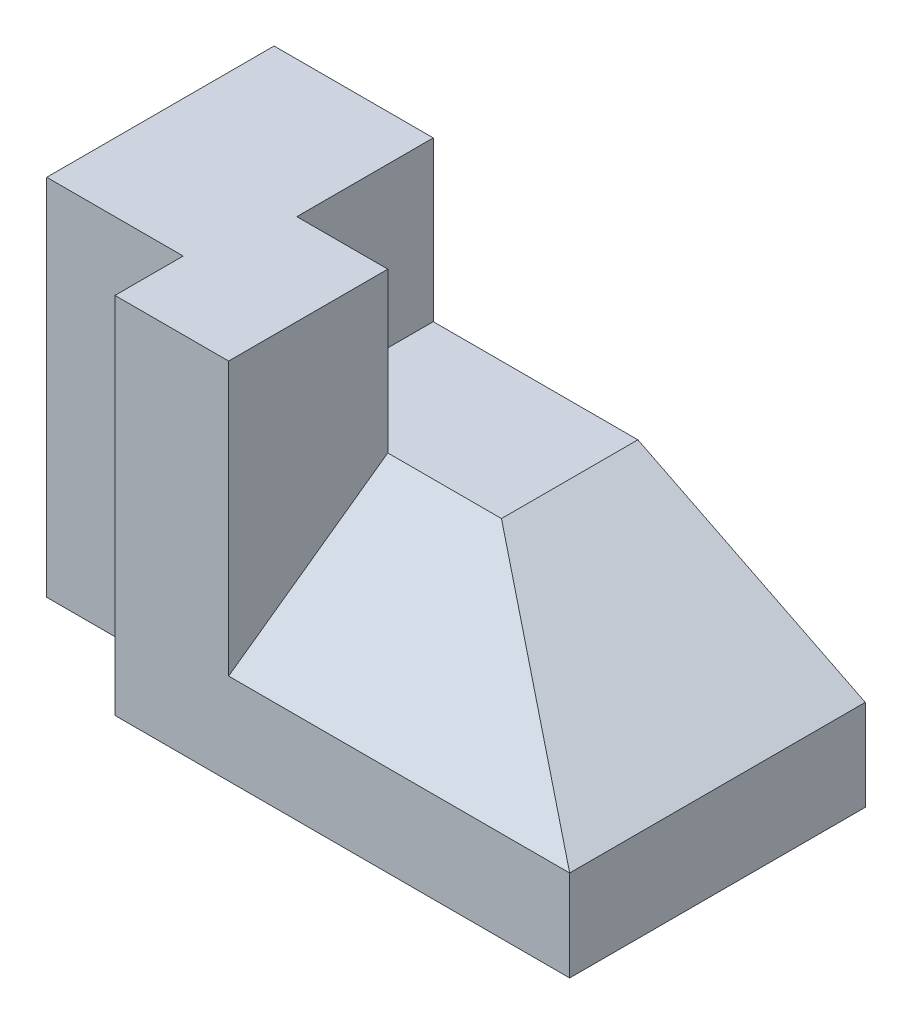
ISO-10303-21;
HEADER;
FILE_DESCRIPTION(('STEP AP214'),'2;1');
FILE_NAME('part.step','',(''),(''),'','','');
FILE_SCHEMA(('AUTOMOTIVE_DESIGN { 1 0 10303 214 1 1 1 1 }'));
ENDSEC;
DATA;
#1=APPLICATION_CONTEXT('core data for automotive mechanical design processes');
#2=APPLICATION_PROTOCOL_DEFINITION('international standard','automotive_design',2000,#1);
#3=PRODUCT_CONTEXT('',#1,'mechanical');
#4=PRODUCT('Part','Part','',(#3));
#5=PRODUCT_RELATED_PRODUCT_CATEGORY('part','',(#4));
#6=PRODUCT_DEFINITION_FORMATION('','',#4);
#7=PRODUCT_DEFINITION_CONTEXT('part definition',#1,'design');
#8=PRODUCT_DEFINITION('design','',#6,#7);
#9=PRODUCT_DEFINITION_SHAPE('','',#8);
#10=(LENGTH_UNIT() NAMED_UNIT(*) SI_UNIT(.MILLI.,.METRE.));
#11=(NAMED_UNIT(*) PLANE_ANGLE_UNIT() SI_UNIT($,.RADIAN.));
#12=(NAMED_UNIT(*) SI_UNIT($,.STERADIAN.) SOLID_ANGLE_UNIT());
#13=UNCERTAINTY_MEASURE_WITH_UNIT(LENGTH_MEASURE(1.E-05),#10,'distance_accuracy_value','');
#14=(GEOMETRIC_REPRESENTATION_CONTEXT(3) GLOBAL_UNCERTAINTY_ASSIGNED_CONTEXT((#13)) GLOBAL_UNIT_ASSIGNED_CONTEXT((#10,
#11,#12)) REPRESENTATION_CONTEXT('',''));
#15=CARTESIAN_POINT('',(0.,0.,0.));
#16=DIRECTION('',(0.,0.,1.));
#17=DIRECTION('',(1.,0.,0.));
#18=AXIS2_PLACEMENT_3D('',#15,#16,#17);
#19=CARTESIAN_POINT('',(4.99999999999999,45.,0.));
#20=DIRECTION('',(1.,0.,0.));
#21=DIRECTION('',(0.,0.,-1.));
#22=AXIS2_PLACEMENT_3D('',#19,#20,#21);
#23=PLANE('',#22);
#24=DIRECTION('',(0.,1.,0.));
#25=VECTOR('',#24,1.);
#26=CARTESIAN_POINT('',(4.99999999999999,45.,-35.));
#27=LINE('',#26,#25);
#28=CARTESIAN_POINT('',(4.99999999999999,45.,-35.));
#29=VERTEX_POINT('',#28);
#30=CARTESIAN_POINT('',(4.99999999999999,80.,-35.));
#31=VERTEX_POINT('',#30);
#32=EDGE_CURVE('E221',#29,#31,#27,.T.);
#33=ORIENTED_EDGE('',*,*,#32,.F.);
#34=DIRECTION('',(0.,0.,1.));
#35=VECTOR('',#34,1.);
#36=CARTESIAN_POINT('',(4.99999999999999,45.,-35.));
#37=LINE('',#36,#35);
#38=CARTESIAN_POINT('',(4.99999999999999,45.,-65.));
#39=VERTEX_POINT('',#38);
#40=EDGE_CURVE('E143',#39,#29,#37,.T.);
#41=ORIENTED_EDGE('',*,*,#40,.F.);
#42=DIRECTION('',(0.,1.,0.));
#43=VECTOR('',#42,1.);
#44=CARTESIAN_POINT('',(4.99999999999999,45.,-65.));
#45=LINE('',#44,#43);
#46=CARTESIAN_POINT('',(4.99999999999999,80.,-65.));
#47=VERTEX_POINT('',#46);
#48=EDGE_CURVE('E220',#39,#47,#45,.T.);
#49=ORIENTED_EDGE('',*,*,#48,.T.);
#50=DIRECTION('',(0.,0.,-1.));
#51=VECTOR('',#50,1.);
#52=CARTESIAN_POINT('',(4.99999999999999,80.,0.));
#53=LINE('',#52,#51);
#54=EDGE_CURVE('E287',#31,#47,#53,.T.);
#55=ORIENTED_EDGE('',*,*,#54,.F.);
#56=EDGE_LOOP('',(#33,#41,#49,#55));
#57=FACE_BOUND('',#56,.T.);
#58=ADVANCED_FACE('F124',(#57),#23,.T.);
#59=CARTESIAN_POINT('',(0.,45.,-35.));
#60=DIRECTION('',(0.,0.,-1.));
#61=DIRECTION('',(-1.,0.,0.));
#62=AXIS2_PLACEMENT_3D('',#59,#60,#61);
#63=PLANE('',#62);
#64=DIRECTION('',(0.,1.,0.));
#65=VECTOR('',#64,1.);
#66=CARTESIAN_POINT('',(25.,45.,-35.));
#67=LINE('',#66,#65);
#68=CARTESIAN_POINT('',(25.,45.,-35.));
#69=VERTEX_POINT('',#68);
#70=CARTESIAN_POINT('',(25.,80.,-35.));
#71=VERTEX_POINT('',#70);
#72=EDGE_CURVE('E216',#69,#71,#67,.T.);
#73=ORIENTED_EDGE('',*,*,#72,.F.);
#74=DIRECTION('',(1.,0.,0.));
#75=VECTOR('',#74,1.);
#76=CARTESIAN_POINT('',(4.99999999999999,45.,-35.));
#77=LINE('',#76,#75);
#78=EDGE_CURVE('E297',#29,#69,#77,.T.);
#79=ORIENTED_EDGE('',*,*,#78,.F.);
#80=ORIENTED_EDGE('',*,*,#32,.T.);
#81=DIRECTION('',(-1.,0.,0.));
#82=VECTOR('',#81,1.);
#83=CARTESIAN_POINT('',(0.,80.,-35.));
#84=LINE('',#83,#82);
#85=EDGE_CURVE('E290',#71,#31,#84,.T.);
#86=ORIENTED_EDGE('',*,*,#85,.F.);
#87=EDGE_LOOP('',(#73,#79,#80,#86));
#88=FACE_BOUND('',#87,.T.);
#89=ADVANCED_FACE('F278',(#88),#63,.T.);
#90=CARTESIAN_POINT('',(0.,0.,-65.));
#91=DIRECTION('',(-1.,0.,0.));
#92=DIRECTION('',(0.,0.,1.));
#93=AXIS2_PLACEMENT_3D('',#90,#91,#92);
#94=PLANE('',#93);
#95=DIRECTION('',(0.,0.,1.));
#96=VECTOR('',#95,1.);
#97=CARTESIAN_POINT('',(0.,80.,-65.));
#98=LINE('',#97,#96);
#99=CARTESIAN_POINT('',(0.,80.,-15.));
#100=VERTEX_POINT('',#99);
#101=CARTESIAN_POINT('',(0.,80.,0.));
#102=VERTEX_POINT('',#101);
#103=EDGE_CURVE('E13',#100,#102,#98,.T.);
#104=ORIENTED_EDGE('',*,*,#103,.F.);
#105=DIRECTION('',(0.,-1.,0.));
#106=VECTOR('',#105,1.);
#107=CARTESIAN_POINT('',(0.,0.,-15.));
#108=LINE('',#107,#106);
#109=CARTESIAN_POINT('',(0.,0.,-15.));
#110=VERTEX_POINT('',#109);
#111=EDGE_CURVE('E189',#100,#110,#108,.T.);
#112=ORIENTED_EDGE('',*,*,#111,.T.);
#113=DIRECTION('',(0.,0.,1.));
#114=VECTOR('',#113,1.);
#115=CARTESIAN_POINT('',(0.,0.,-65.));
#116=LINE('',#115,#114);
#117=CARTESIAN_POINT('',(0.,0.,0.));
#118=VERTEX_POINT('',#117);
#119=EDGE_CURVE('E201',#110,#118,#116,.T.);
#120=ORIENTED_EDGE('',*,*,#119,.T.);
#121=DIRECTION('',(0.,-1.,0.));
#122=VECTOR('',#121,1.);
#123=CARTESIAN_POINT('',(0.,0.,0.));
#124=LINE('',#123,#122);
#125=EDGE_CURVE('E233',#102,#118,#124,.T.);
#126=ORIENTED_EDGE('',*,*,#125,.F.);
#127=EDGE_LOOP('',(#104,#112,#120,#126));
#128=FACE_BOUND('',#127,.T.);
#129=ADVANCED_FACE('F126',(#128),#94,.T.);
#130=CARTESIAN_POINT('',(0.,80.,-65.));
#131=DIRECTION('',(0.,1.,0.));
#132=DIRECTION('',(0.,0.,1.));
#133=AXIS2_PLACEMENT_3D('',#130,#131,#132);
#134=PLANE('',#133);
#135=ORIENTED_EDGE('',*,*,#85,.T.);
#136=ORIENTED_EDGE('',*,*,#54,.T.);
#137=DIRECTION('',(-1.,0.,0.));
#138=VECTOR('',#137,1.);
#139=CARTESIAN_POINT('',(0.,80.,-65.));
#140=LINE('',#139,#138);
#141=CARTESIAN_POINT('',(-30.,80.,-65.));
#142=VERTEX_POINT('',#141);
#143=EDGE_CURVE('E208',#47,#142,#140,.T.);
#144=ORIENTED_EDGE('',*,*,#143,.T.);
#145=DIRECTION('',(0.,0.,-1.));
#146=VECTOR('',#145,1.);
#147=CARTESIAN_POINT('',(-30.,80.,0.));
#148=LINE('',#147,#146);
#149=CARTESIAN_POINT('',(-30.,80.,-15.));
#150=VERTEX_POINT('',#149);
#151=EDGE_CURVE('E377',#150,#142,#148,.T.);
#152=ORIENTED_EDGE('',*,*,#151,.F.);
#153=DIRECTION('',(1.,0.,0.));
#154=VECTOR('',#153,1.);
#155=CARTESIAN_POINT('',(-30.,80.,-15.));
#156=LINE('',#155,#154);
#157=EDGE_CURVE('E196',#150,#100,#156,.T.);
#158=ORIENTED_EDGE('',*,*,#157,.T.);
#159=ORIENTED_EDGE('',*,*,#103,.T.);
#160=DIRECTION('',(-1.,0.,0.));
#161=VECTOR('',#160,1.);
#162=CARTESIAN_POINT('',(0.,80.,0.));
#163=LINE('',#162,#161);
#164=CARTESIAN_POINT('',(25.,80.,0.));
#165=VERTEX_POINT('',#164);
#166=EDGE_CURVE('E231',#165,#102,#163,.T.);
#167=ORIENTED_EDGE('',*,*,#166,.F.);
#168=DIRECTION('',(0.,0.,1.));
#169=VECTOR('',#168,1.);
#170=CARTESIAN_POINT('',(25.,80.,-65.));
#171=LINE('',#170,#169);
#172=EDGE_CURVE('E134',#71,#165,#171,.T.);
#173=ORIENTED_EDGE('',*,*,#172,.F.);
#174=EDGE_LOOP('',(#135,#136,#144,#152,#158,#159,#167,#173));
#175=FACE_BOUND('',#174,.T.);
#176=ADVANCED_FACE('F267',(#175),#134,.T.);
#177=CARTESIAN_POINT('',(25.,20.,-65.));
#178=DIRECTION('',(1.,0.,0.));
#179=DIRECTION('',(0.,0.,-1.));
#180=AXIS2_PLACEMENT_3D('',#177,#178,#179);
#181=PLANE('',#180);
#182=DIRECTION('',(0.,-0.581238193719096,0.813733471206735));
#183=VECTOR('',#182,1.);
#184=CARTESIAN_POINT('',(25.,50.7432432432432,-43.0405405405405));
#185=LINE('',#184,#183);
#186=CARTESIAN_POINT('',(25.,20.,0.));
#187=VERTEX_POINT('',#186);
#188=EDGE_CURVE('E202',#69,#187,#185,.T.);
#189=ORIENTED_EDGE('',*,*,#188,.F.);
#190=ORIENTED_EDGE('',*,*,#72,.T.);
#191=ORIENTED_EDGE('',*,*,#172,.T.);
#192=DIRECTION('',(0.,1.,0.));
#193=VECTOR('',#192,1.);
#194=CARTESIAN_POINT('',(25.,20.,0.));
#195=LINE('',#194,#193);
#196=EDGE_CURVE('E238',#187,#165,#195,.T.);
#197=ORIENTED_EDGE('',*,*,#196,.F.);
#198=EDGE_LOOP('',(#189,#190,#191,#197));
#199=FACE_BOUND('',#198,.T.);
#200=ADVANCED_FACE('F260',(#199),#181,.T.);
#201=CARTESIAN_POINT('',(0.,0.,-65.));
#202=DIRECTION('',(0.,0.,-1.));
#203=DIRECTION('',(-1.,0.,0.));
#204=AXIS2_PLACEMENT_3D('',#201,#202,#203);
#205=PLANE('',#204);
#206=ORIENTED_EDGE('',*,*,#48,.F.);
#207=DIRECTION('',(-1.,0.,0.));
#208=VECTOR('',#207,1.);
#209=CARTESIAN_POINT('',(4.99999999999999,45.,-65.));
#210=LINE('',#209,#208);
#211=CARTESIAN_POINT('',(50.,45.,-65.));
#212=VERTEX_POINT('',#211);
#213=EDGE_CURVE('E300',#212,#39,#210,.T.);
#214=ORIENTED_EDGE('',*,*,#213,.F.);
#215=CARTESIAN_POINT('',(50.,45.,-65.));
#216=CARTESIAN_POINT('',(66.6666666666667,36.6666666666667,-65.));
#217=CARTESIAN_POINT('',(83.3333333333333,28.3333333333333,-65.));
#218=CARTESIAN_POINT('',(100.,20.,-65.));
#219=B_SPLINE_CURVE_WITH_KNOTS('',3,(#215,#216,#217,#218),.UNSPECIFIED.,.F.,.F.,(4,4),(0.,1.),.UNSPECIFIED.);
#220=CARTESIAN_POINT('',(100.,20.,-65.));
#221=VERTEX_POINT('',#220);
#222=EDGE_CURVE('E338',#212,#221,#219,.T.);
#223=ORIENTED_EDGE('',*,*,#222,.T.);
#224=DIRECTION('',(0.,1.,0.));
#225=VECTOR('',#224,1.);
#226=CARTESIAN_POINT('',(100.,20.,-65.));
#227=LINE('',#226,#225);
#228=CARTESIAN_POINT('',(100.,0.,-65.));
#229=VERTEX_POINT('',#228);
#230=EDGE_CURVE('E212',#229,#221,#227,.T.);
#231=ORIENTED_EDGE('',*,*,#230,.F.);
#232=DIRECTION('',(1.,0.,0.));
#233=VECTOR('',#232,1.);
#234=CARTESIAN_POINT('',(0.,0.,-65.));
#235=LINE('',#234,#233);
#236=CARTESIAN_POINT('',(-30.,0.,-65.));
#237=VERTEX_POINT('',#236);
#238=EDGE_CURVE('E230',#237,#229,#235,.T.);
#239=ORIENTED_EDGE('',*,*,#238,.F.);
#240=DIRECTION('',(0.,-1.,0.));
#241=VECTOR('',#240,1.);
#242=CARTESIAN_POINT('',(-30.,0.,-65.));
#243=LINE('',#242,#241);
#244=EDGE_CURVE('E371',#142,#237,#243,.T.);
#245=ORIENTED_EDGE('',*,*,#244,.F.);
#246=ORIENTED_EDGE('',*,*,#143,.F.);
#247=EDGE_LOOP('',(#206,#214,#223,#231,#239,#245,#246));
#248=FACE_BOUND('',#247,.T.);
#249=ADVANCED_FACE('F249',(#248),#205,.T.);
#250=CARTESIAN_POINT('',(100.,20.,-65.));
#251=DIRECTION('',(1.,0.,0.));
#252=DIRECTION('',(0.,1.,0.));
#253=AXIS2_PLACEMENT_3D('',#250,#251,#252);
#254=PLANE('',#253);
#255=DIRECTION('',(0.,1.,0.));
#256=VECTOR('',#255,1.);
#257=CARTESIAN_POINT('',(100.,20.,0.));
#258=LINE('',#257,#256);
#259=CARTESIAN_POINT('',(100.,0.,0.));
#260=VERTEX_POINT('',#259);
#261=CARTESIAN_POINT('',(100.,20.,0.));
#262=VERTEX_POINT('',#261);
#263=EDGE_CURVE('E236',#260,#262,#258,.T.);
#264=ORIENTED_EDGE('',*,*,#263,.F.);
#265=DIRECTION('',(0.,0.,1.));
#266=VECTOR('',#265,1.);
#267=CARTESIAN_POINT('',(100.,0.,-65.));
#268=LINE('',#267,#266);
#269=EDGE_CURVE('E170',#229,#260,#268,.T.);
#270=ORIENTED_EDGE('',*,*,#269,.F.);
#271=ORIENTED_EDGE('',*,*,#230,.T.);
#272=DIRECTION('',(0.,0.,1.));
#273=VECTOR('',#272,1.);
#274=CARTESIAN_POINT('',(100.,20.,-65.));
#275=LINE('',#274,#273);
#276=EDGE_CURVE('E159',#221,#262,#275,.T.);
#277=ORIENTED_EDGE('',*,*,#276,.T.);
#278=EDGE_LOOP('',(#264,#270,#271,#277));
#279=FACE_BOUND('',#278,.T.);
#280=ADVANCED_FACE('F259',(#279),#254,.T.);
#281=CARTESIAN_POINT('',(0.,0.,-65.));
#282=DIRECTION('',(0.,-1.,0.));
#283=DIRECTION('',(0.,0.,-1.));
#284=AXIS2_PLACEMENT_3D('',#281,#282,#283);
#285=PLANE('',#284);
#286=DIRECTION('',(1.,0.,0.));
#287=VECTOR('',#286,1.);
#288=CARTESIAN_POINT('',(0.,0.,0.));
#289=LINE('',#288,#287);
#290=EDGE_CURVE('E206',#118,#260,#289,.T.);
#291=ORIENTED_EDGE('',*,*,#290,.F.);
#292=ORIENTED_EDGE('',*,*,#119,.F.);
#293=DIRECTION('',(1.,0.,0.));
#294=VECTOR('',#293,1.);
#295=CARTESIAN_POINT('',(-30.,0.,-15.));
#296=LINE('',#295,#294);
#297=CARTESIAN_POINT('',(-30.,0.,-15.));
#298=VERTEX_POINT('',#297);
#299=EDGE_CURVE('E184',#298,#110,#296,.T.);
#300=ORIENTED_EDGE('',*,*,#299,.F.);
#301=DIRECTION('',(0.,0.,1.));
#302=VECTOR('',#301,1.);
#303=CARTESIAN_POINT('',(-30.,0.,0.));
#304=LINE('',#303,#302);
#305=EDGE_CURVE('E197',#237,#298,#304,.T.);
#306=ORIENTED_EDGE('',*,*,#305,.F.);
#307=ORIENTED_EDGE('',*,*,#238,.T.);
#308=ORIENTED_EDGE('',*,*,#269,.T.);
#309=EDGE_LOOP('',(#291,#292,#300,#306,#307,#308));
#310=FACE_BOUND('',#309,.T.);
#311=ADVANCED_FACE('F204',(#310),#285,.T.);
#312=CARTESIAN_POINT('',(0.,0.,0.));
#313=DIRECTION('',(0.,0.,-1.));
#314=DIRECTION('',(-1.,0.,0.));
#315=AXIS2_PLACEMENT_3D('',#312,#313,#314);
#316=PLANE('',#315);
#317=ORIENTED_EDGE('',*,*,#125,.T.);
#318=ORIENTED_EDGE('',*,*,#290,.T.);
#319=ORIENTED_EDGE('',*,*,#263,.T.);
#320=DIRECTION('',(-1.,0.,0.));
#321=VECTOR('',#320,1.);
#322=CARTESIAN_POINT('',(0.,20.,0.));
#323=LINE('',#322,#321);
#324=EDGE_CURVE('E128',#262,#187,#323,.T.);
#325=ORIENTED_EDGE('',*,*,#324,.T.);
#326=ORIENTED_EDGE('',*,*,#196,.T.);
#327=ORIENTED_EDGE('',*,*,#166,.T.);
#328=EDGE_LOOP('',(#317,#318,#319,#325,#326,#327));
#329=FACE_BOUND('',#328,.T.);
#330=ADVANCED_FACE('F263',(#329),#316,.F.);
#331=CARTESIAN_POINT('',(-30.,0.,-15.));
#332=DIRECTION('',(0.,0.,1.));
#333=DIRECTION('',(1.,0.,0.));
#334=AXIS2_PLACEMENT_3D('',#331,#332,#333);
#335=PLANE('',#334);
#336=ORIENTED_EDGE('',*,*,#111,.F.);
#337=ORIENTED_EDGE('',*,*,#157,.F.);
#338=DIRECTION('',(0.,-1.,0.));
#339=VECTOR('',#338,1.);
#340=CARTESIAN_POINT('',(-30.,0.,-15.));
#341=LINE('',#340,#339);
#342=EDGE_CURVE('E193',#150,#298,#341,.T.);
#343=ORIENTED_EDGE('',*,*,#342,.T.);
#344=ORIENTED_EDGE('',*,*,#299,.T.);
#345=EDGE_LOOP('',(#336,#337,#343,#344));
#346=FACE_BOUND('',#345,.T.);
#347=ADVANCED_FACE('F186',(#346),#335,.T.);
#348=CARTESIAN_POINT('',(-30.,0.,0.));
#349=DIRECTION('',(-1.,0.,0.));
#350=DIRECTION('',(0.,0.,1.));
#351=AXIS2_PLACEMENT_3D('',#348,#349,#350);
#352=PLANE('',#351);
#353=ORIENTED_EDGE('',*,*,#342,.F.);
#354=ORIENTED_EDGE('',*,*,#151,.T.);
#355=ORIENTED_EDGE('',*,*,#244,.T.);
#356=ORIENTED_EDGE('',*,*,#305,.T.);
#357=EDGE_LOOP('',(#353,#354,#355,#356));
#358=FACE_BOUND('',#357,.T.);
#359=ADVANCED_FACE('F392',(#358),#352,.T.);
#360=CARTESIAN_POINT('',(0.,45.,0.));
#361=DIRECTION('',(0.,-1.,0.));
#362=DIRECTION('',(0.,0.,-1.));
#363=AXIS2_PLACEMENT_3D('',#360,#361,#362);
#364=PLANE('',#363);
#365=ORIENTED_EDGE('',*,*,#40,.T.);
#366=ORIENTED_EDGE('',*,*,#78,.T.);
#367=CARTESIAN_POINT('',(50.,45.,-35.));
#368=VERTEX_POINT('',#367);
#369=EDGE_CURVE('E318',#69,#368,#77,.T.);
#370=ORIENTED_EDGE('',*,*,#369,.T.);
#371=DIRECTION('',(0.,0.,-1.));
#372=VECTOR('',#371,1.);
#373=CARTESIAN_POINT('',(50.,45.,-35.));
#374=LINE('',#373,#372);
#375=EDGE_CURVE('E303',#368,#212,#374,.T.);
#376=ORIENTED_EDGE('',*,*,#375,.T.);
#377=ORIENTED_EDGE('',*,*,#213,.T.);
#378=EDGE_LOOP('',(#365,#366,#370,#376,#377));
#379=FACE_BOUND('',#378,.T.);
#380=ADVANCED_FACE('F294',(#379),#364,.F.);
#381=CARTESIAN_POINT('',(50.,45.,-35.));
#382=DIRECTION('',(0.,0.813733471206735,0.581238193719096));
#383=DIRECTION('',(-1.,0.,0.));
#384=AXIS2_PLACEMENT_3D('',#381,#382,#383);
#385=PLANE('',#384);
#386=ORIENTED_EDGE('',*,*,#369,.F.);
#387=ORIENTED_EDGE('',*,*,#188,.T.);
#388=ORIENTED_EDGE('',*,*,#324,.F.);
#389=CARTESIAN_POINT('',(50.,45.,-35.));
#390=CARTESIAN_POINT('',(66.6666666666666,36.6666666666667,-23.3333333333333));
#391=CARTESIAN_POINT('',(83.3333333333333,28.3333333333333,-11.6666666666667));
#392=CARTESIAN_POINT('',(100.,20.,0.));
#393=B_SPLINE_CURVE_WITH_KNOTS('',3,(#389,#390,#391,#392),.UNSPECIFIED.,.F.,.F.,(4,4),(0.,1.),.UNSPECIFIED.);
#394=EDGE_CURVE('E341',#368,#262,#393,.T.);
#395=ORIENTED_EDGE('',*,*,#394,.F.);
#396=EDGE_LOOP('',(#386,#387,#388,#395));
#397=FACE_BOUND('',#396,.T.);
#398=ADVANCED_FACE('F406',(#397),#385,.T.);
#399=CARTESIAN_POINT('',(50.,45.,-65.));
#400=DIRECTION('',(0.447213595499958,0.894427190999916,0.));
#401=DIRECTION('',(0.,0.,1.));
#402=AXIS2_PLACEMENT_3D('',#399,#400,#401);
#403=PLANE('',#402);
#404=ORIENTED_EDGE('',*,*,#375,.F.);
#405=ORIENTED_EDGE('',*,*,#394,.T.);
#406=ORIENTED_EDGE('',*,*,#276,.F.);
#407=ORIENTED_EDGE('',*,*,#222,.F.);
#408=EDGE_LOOP('',(#404,#405,#406,#407));
#409=FACE_BOUND('',#408,.T.);
#410=ADVANCED_FACE('F340',(#409),#403,.T.);
#411=CLOSED_SHELL('',(#58,#89,#129,#176,#200,#249,#280,#311,#330,#347,#359,#380,#398,#410));
#412=MANIFOLD_SOLID_BREP('B2',#411);
#413=ADVANCED_BREP_SHAPE_REPRESENTATION('',(#18,#412),#14);
#414=SHAPE_DEFINITION_REPRESENTATION(#9,#413);
ENDSEC;
END-ISO-10303-21;
